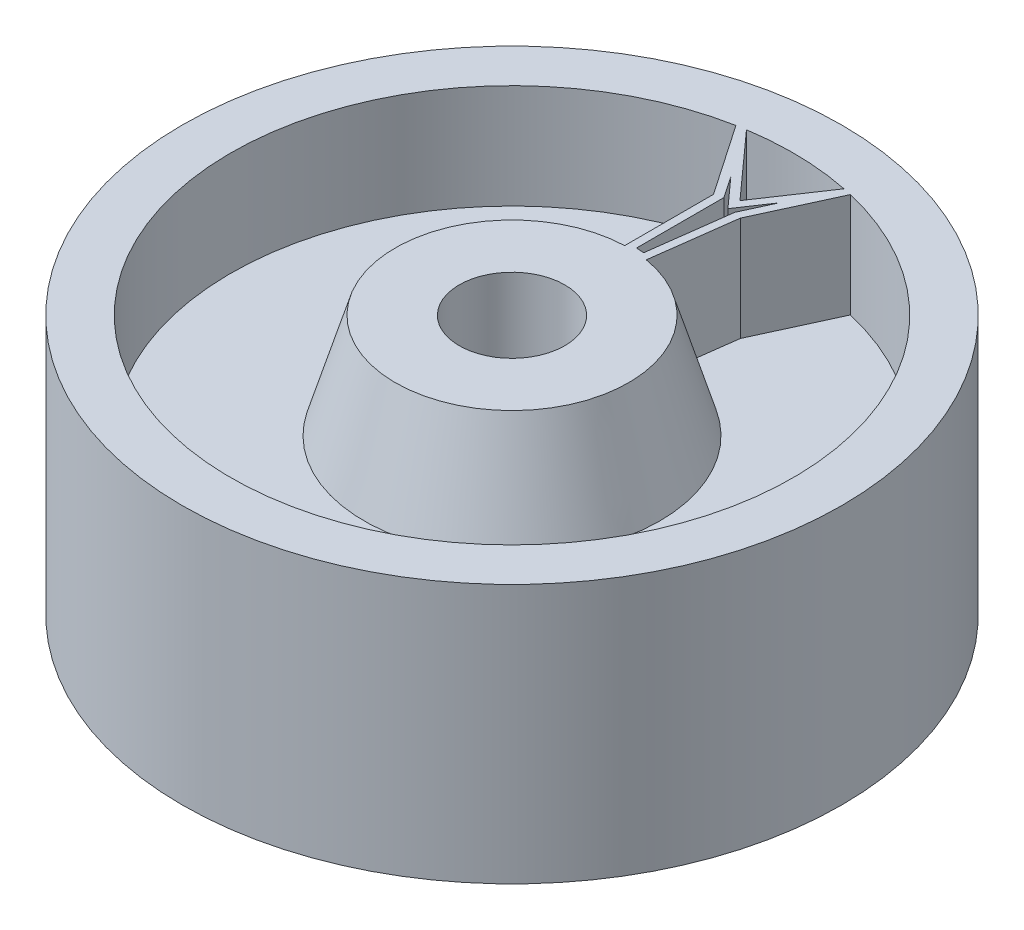
ISO-10303-21;
HEADER;
FILE_DESCRIPTION(('STEP AP214'),'2;1');
FILE_NAME('part.step','',(''),(''),'','','');
FILE_SCHEMA(('AUTOMOTIVE_DESIGN { 1 0 10303 214 1 1 1 1 }'));
ENDSEC;
DATA;
#1=APPLICATION_CONTEXT('core data for automotive mechanical design processes');
#2=APPLICATION_PROTOCOL_DEFINITION('international standard','automotive_design',2000,#1);
#3=PRODUCT_CONTEXT('',#1,'mechanical');
#4=PRODUCT('Part','Part','',(#3));
#5=PRODUCT_RELATED_PRODUCT_CATEGORY('part','',(#4));
#6=PRODUCT_DEFINITION_FORMATION('','',#4);
#7=PRODUCT_DEFINITION_CONTEXT('part definition',#1,'design');
#8=PRODUCT_DEFINITION('design','',#6,#7);
#9=PRODUCT_DEFINITION_SHAPE('','',#8);
#10=(LENGTH_UNIT() NAMED_UNIT(*) SI_UNIT(.MILLI.,.METRE.));
#11=(NAMED_UNIT(*) PLANE_ANGLE_UNIT() SI_UNIT($,.RADIAN.));
#12=(NAMED_UNIT(*) SI_UNIT($,.STERADIAN.) SOLID_ANGLE_UNIT());
#13=UNCERTAINTY_MEASURE_WITH_UNIT(LENGTH_MEASURE(1.E-05),#10,'distance_accuracy_value','');
#14=(GEOMETRIC_REPRESENTATION_CONTEXT(3) GLOBAL_UNCERTAINTY_ASSIGNED_CONTEXT((#13)) GLOBAL_UNIT_ASSIGNED_CONTEXT((#10,
#11,#12)) REPRESENTATION_CONTEXT('',''));
#15=CARTESIAN_POINT('',(0.,0.,0.));
#16=DIRECTION('',(0.,0.,1.));
#17=DIRECTION('',(1.,0.,0.));
#18=AXIS2_PLACEMENT_3D('',#15,#16,#17);
#19=CARTESIAN_POINT('',(0.,205.951906895944,0.));
#20=DIRECTION('',(0.,-1.,0.));
#21=DIRECTION('',(0.,0.,-1.));
#22=AXIS2_PLACEMENT_3D('',#19,#20,#21);
#23=CONICAL_SURFACE('',#22,185.425932002848,0.289503671961389);
#24=CARTESIAN_POINT('',(30.3648693949941,205.952106895944,-182.922740173142));
#25=CARTESIAN_POINT('',(30.8991054674038,192.151055759675,-187.001261731952));
#26=CARTESIAN_POINT('',(31.4333229107025,178.34996187389,-191.079641070431));
#27=CARTESIAN_POINT('',(32.5017260942476,150.74770135788,-199.236157716594));
#28=CARTESIAN_POINT('',(33.0359118344941,136.946534727655,-203.314295024277));
#29=CARTESIAN_POINT('',(34.1042571673054,109.344141472182,-211.470370020246));
#30=CARTESIAN_POINT('',(34.6384167598702,95.5429148469328,-215.548307708531));
#31=CARTESIAN_POINT('',(35.706713687662,67.9404105255742,-223.704013165776));
#32=CARTESIAN_POINT('',(36.240851022889,54.1391328294643,-227.781780934738));
#33=CARTESIAN_POINT('',(36.774979174481,40.337834063574,-231.85947859302));
#34=B_SPLINE_CURVE_WITH_KNOTS('',3,(#24,#25,#26,#27,#28,#29,#30,#31,#32,#33),.UNSPECIFIED.,.F.,
.F.,(4,2,2,2,4),(0.,43.2029955974903,86.4059911853262,129.608986770069,172.811982364436),.UNSPECIFIED.);
#35=CARTESIAN_POINT('',(30.3648771369603,205.951906895944,-182.92279927768));
#36=VERTEX_POINT('',#35);
#37=CARTESIAN_POINT('',(36.7749714342237,40.338034063574,-231.859419501529));
#38=VERTEX_POINT('',#37);
#39=EDGE_CURVE('E62',#36,#38,#34,.T.);
#40=ORIENTED_EDGE('',*,*,#39,.F.);
#41=CARTESIAN_POINT('',(0.,205.951906895944,0.));
#42=DIRECTION('',(0.,-1.,0.));
#43=DIRECTION('',(0.,0.,-1.));
#44=AXIS2_PLACEMENT_3D('',#41,#42,#43);
#45=CIRCLE('',#44,185.425932002848);
#46=CARTESIAN_POINT('',(-6.35,205.951906895944,-185.317170707749));
#47=VERTEX_POINT('',#46);
#48=EDGE_CURVE('E57',#36,#47,#45,.T.);
#49=ORIENTED_EDGE('',*,*,#48,.T.);
#50=CARTESIAN_POINT('',(-6.35,-134.258735067442,-286.694957783067));
#51=CARTESIAN_POINT('',(-6.35,-98.6265316781337,-276.078478487281));
#52=CARTESIAN_POINT('',(-6.35,-62.994392949212,-265.461782141148));
#53=CARTESIAN_POINT('',(-6.35,8.26965570479505,-244.227621210996));
#54=CARTESIAN_POINT('',(-6.35,43.9015656298797,-233.610156626974));
#55=CARTESIAN_POINT('',(-6.35,115.165056681502,-212.3741252363));
#56=CARTESIAN_POINT('',(-6.35,150.796637808043,-201.755558429658));
#57=CARTESIAN_POINT('',(-6.35,222.059282674897,-180.516688908846));
#58=CARTESIAN_POINT('',(-6.35,257.690346415211,-169.896386194679));
#59=CARTESIAN_POINT('',(-6.35,307.859096544723,-154.940625479311));
#60=CARTESIAN_POINT('',(-6.35,322.397157509582,-150.606424000766));
#61=CARTESIAN_POINT('',(-6.35,351.473079405832,-141.937350050352));
#62=CARTESIAN_POINT('',(-6.35,366.010940337221,-137.60247757848));
#63=CARTESIAN_POINT('',(-6.35,380.54867602696,-133.267185093496));
#64=B_SPLINE_CURVE_WITH_KNOTS('',3,(#50,#51,#52,#53,#54,#55,#56,#57,#58,#59,#60,#61,#62,#63),
.UNSPECIFIED.,.F.,.F.,(4,2,2,2,2,2,4),(0.,111.540449891671,223.080900085614,334.62134928247,
446.16179834175,491.672947199809,537.184096134438),.UNSPECIFIED.);
#65=CARTESIAN_POINT('',(-6.34999999999999,40.338034063574,-234.67182710239));
#66=VERTEX_POINT('',#65);
#67=EDGE_CURVE('E278',#66,#47,#64,.T.);
#68=ORIENTED_EDGE('',*,*,#67,.F.);
#69=CARTESIAN_POINT('',(0.,40.338034063574,0.));
#70=DIRECTION('',(0.,-1.,0.));
#71=DIRECTION('',(0.,0.,-1.));
#72=AXIS2_PLACEMENT_3D('',#69,#70,#71);
#73=CIRCLE('',#72,234.757723910363);
#74=EDGE_CURVE('E305',#38,#66,#73,.T.);
#75=ORIENTED_EDGE('',*,*,#74,.F.);
#76=EDGE_LOOP('',(#40,#49,#68,#75));
#77=FACE_BOUND('',#76,.T.);
#78=ADVANCED_FACE('F37',(#77),#23,.T.);
#79=CARTESIAN_POINT('',(-234.757723910363,40.338034063574,0.));
#80=DIRECTION('',(0.,-1.,0.));
#81=DIRECTION('',(0.,0.,-1.));
#82=AXIS2_PLACEMENT_3D('',#79,#80,#81);
#83=PLANE('',#82);
#84=DIRECTION('',(0.129878207357136,0.,-0.991529954793952));
#85=VECTOR('',#84,1.);
#86=CARTESIAN_POINT('',(2.33624005513325,40.338034063574,31.0563880255489));
#87=LINE('',#86,#85);
#88=CARTESIAN_POINT('',(47.6624694217819,40.338034063574,-314.977908793103));
#89=VERTEX_POINT('',#88);
#90=EDGE_CURVE('E346',#38,#89,#87,.T.);
#91=ORIENTED_EDGE('',*,*,#90,.F.);
#92=ORIENTED_EDGE('',*,*,#74,.T.);
#93=DIRECTION('',(0.,0.,1.));
#94=VECTOR('',#93,1.);
#95=CARTESIAN_POINT('',(-6.34999999999999,40.338034063574,0.));
#96=LINE('',#95,#94);
#97=CARTESIAN_POINT('',(-6.35,40.3380340635741,-326.474703970382));
#98=VERTEX_POINT('',#97);
#99=EDGE_CURVE('E343',#98,#66,#96,.T.);
#100=ORIENTED_EDGE('',*,*,#99,.F.);
#101=DIRECTION('',(0.564567927961281,0.,0.825386609242909));
#102=VECTOR('',#101,1.);
#103=CARTESIAN_POINT('',(72.9809249152727,40.338034063574,-210.494535985333));
#104=LINE('',#103,#102);
#105=CARTESIAN_POINT('',(-83.2749369819289,40.338034063574,-438.937367464248));
#106=VERTEX_POINT('',#105);
#107=EDGE_CURVE('E180',#106,#98,#104,.T.);
#108=ORIENTED_EDGE('',*,*,#107,.F.);
#109=CARTESIAN_POINT('',(0.,40.338034063574,0.));
#110=DIRECTION('',(0.,-1.,0.));
#111=DIRECTION('',(0.,0.,-1.));
#112=AXIS2_PLACEMENT_3D('',#109,#110,#111);
#113=CIRCLE('',#112,446.766972465276);
#114=CARTESIAN_POINT('',(102.681772682512,40.338034063574,-434.807062091413));
#115=VERTEX_POINT('',#114);
#116=EDGE_CURVE('E301',#115,#106,#113,.T.);
#117=ORIENTED_EDGE('',*,*,#116,.F.);
#118=DIRECTION('',(0.417266365347938,0.,-0.908784232009623));
#119=VECTOR('',#118,1.);
#120=CARTESIAN_POINT('',(-120.951282208579,40.338034063574,52.2539879208453));
#121=LINE('',#120,#119);
#122=EDGE_CURVE('E284',#89,#115,#121,.T.);
#123=ORIENTED_EDGE('',*,*,#122,.F.);
#124=EDGE_LOOP('',(#91,#92,#100,#108,#117,#123));
#125=FACE_BOUND('',#124,.T.);
#126=ADVANCED_FACE('F388',(#125),#83,.F.);
#127=DIRECTION('',(-0.556917904062446,0.,0.830567545799071));
#128=VECTOR('',#127,1.);
#129=CARTESIAN_POINT('',(-213.406083510078,40.338034063574,14.3168498217463));
#130=LINE('',#129,#128);
#131=CARTESIAN_POINT('',(89.667443425751,40.338034063574,-437.676224251762));
#132=VERTEX_POINT('',#131);
#133=CARTESIAN_POINT('',(23.3338890946393,40.338034063574,-338.748721610829));
#134=VERTEX_POINT('',#133);
#135=EDGE_CURVE('E287',#132,#134,#130,.T.);
#136=ORIENTED_EDGE('',*,*,#135,.F.);
#137=CARTESIAN_POINT('',(-68.9948603055098,40.338034063574,-441.407336750549));
#138=VERTEX_POINT('',#137);
#139=EDGE_CURVE('E298',#138,#132,#113,.T.);
#140=ORIENTED_EDGE('',*,*,#139,.F.);
#141=DIRECTION('',(-0.668708579859901,0.,-0.743524602970039));
#142=VECTOR('',#141,1.);
#143=CARTESIAN_POINT('',(76.3490603259006,40.338034063574,-279.802141099822));
#144=LINE('',#143,#142);
#145=EDGE_CURVE('E290',#134,#138,#144,.T.);
#146=ORIENTED_EDGE('',*,*,#145,.F.);
#147=EDGE_LOOP('',(#136,#140,#146));
#148=FACE_BOUND('',#147,.T.);
#149=ADVANCED_FACE('F392',(#148),#83,.F.);
#150=CARTESIAN_POINT('',(0.,0.,0.));
#151=DIRECTION('',(0.,-1.,0.));
#152=DIRECTION('',(0.,0.,-1.));
#153=AXIS2_PLACEMENT_3D('',#150,#151,#152);
#154=CYLINDRICAL_SURFACE('',#153,446.766972465276);
#155=DIRECTION('',(0.,-1.,0.));
#156=VECTOR('',#155,1.);
#157=CARTESIAN_POINT('',(102.681772682512,0.,-434.807062091413));
#158=LINE('',#157,#156);
#159=CARTESIAN_POINT('',(102.681772682512,205.951906895944,-434.807062091413));
#160=VERTEX_POINT('',#159);
#161=EDGE_CURVE('E340',#115,#160,#158,.F.);
#162=ORIENTED_EDGE('',*,*,#161,.F.);
#163=ORIENTED_EDGE('',*,*,#116,.T.);
#164=DIRECTION('',(0.,-1.,0.));
#165=VECTOR('',#164,1.);
#166=CARTESIAN_POINT('',(-83.2749369819289,0.,-438.937367464248));
#167=LINE('',#166,#165);
#168=CARTESIAN_POINT('',(-83.2749369819289,205.951906895944,-438.937367464248));
#169=VERTEX_POINT('',#168);
#170=EDGE_CURVE('E331',#169,#106,#167,.T.);
#171=ORIENTED_EDGE('',*,*,#170,.F.);
#172=CARTESIAN_POINT('',(0.,205.951906895944,0.));
#173=DIRECTION('',(0.,-1.,0.));
#174=DIRECTION('',(0.,0.,-1.));
#175=AXIS2_PLACEMENT_3D('',#172,#173,#174);
#176=CIRCLE('',#175,446.766972465276);
#177=EDGE_CURVE('E297',#160,#169,#176,.T.);
#178=ORIENTED_EDGE('',*,*,#177,.F.);
#179=EDGE_LOOP('',(#162,#163,#171,#178));
#180=FACE_BOUND('',#179,.T.);
#181=ADVANCED_FACE('F407',(#180),#154,.F.);
#182=DIRECTION('',(0.,-1.,0.));
#183=VECTOR('',#182,1.);
#184=CARTESIAN_POINT('',(89.667443425751,0.,-437.676224251762));
#185=LINE('',#184,#183);
#186=CARTESIAN_POINT('',(89.667443425751,205.951906895944,-437.676224251762));
#187=VERTEX_POINT('',#186);
#188=EDGE_CURVE('E337',#187,#132,#185,.T.);
#189=ORIENTED_EDGE('',*,*,#188,.F.);
#190=CARTESIAN_POINT('',(-68.9948603055098,205.951906895944,-441.407336750549));
#191=VERTEX_POINT('',#190);
#192=EDGE_CURVE('E242',#191,#187,#176,.T.);
#193=ORIENTED_EDGE('',*,*,#192,.F.);
#194=DIRECTION('',(0.,-1.,0.));
#195=VECTOR('',#194,1.);
#196=CARTESIAN_POINT('',(-68.9948603055098,0.,-441.407336750548));
#197=LINE('',#196,#195);
#198=EDGE_CURVE('E334',#138,#191,#197,.F.);
#199=ORIENTED_EDGE('',*,*,#198,.F.);
#200=ORIENTED_EDGE('',*,*,#139,.T.);
#201=EDGE_LOOP('',(#189,#193,#199,#200));
#202=FACE_BOUND('',#201,.T.);
#203=ADVANCED_FACE('F412',(#202),#154,.F.);
#204=CARTESIAN_POINT('',(0.,0.,0.));
#205=DIRECTION('',(0.,-1.,0.));
#206=DIRECTION('',(0.,0.,-1.));
#207=AXIS2_PLACEMENT_3D('',#204,#205,#206);
#208=CYLINDRICAL_SURFACE('',#207,523.701076511519);
#209=CARTESIAN_POINT('',(0.,-205.951906895944,0.));
#210=DIRECTION('',(0.,-1.,0.));
#211=DIRECTION('',(0.,0.,-1.));
#212=AXIS2_PLACEMENT_3D('',#209,#210,#211);
#213=CIRCLE('',#212,523.701076511519);
#214=CARTESIAN_POINT('',(0.,-205.951906895944,-523.701076511519));
#215=VERTEX_POINT('',#214);
#216=EDGE_CURVE('E325',#215,#215,#213,.T.);
#217=ORIENTED_EDGE('',*,*,#216,.F.);
#218=EDGE_LOOP('',(#217));
#219=FACE_BOUND('',#218,.T.);
#220=CARTESIAN_POINT('',(0.,205.951906895944,0.));
#221=DIRECTION('',(0.,-1.,0.));
#222=DIRECTION('',(0.,0.,-1.));
#223=AXIS2_PLACEMENT_3D('',#220,#221,#222);
#224=CIRCLE('',#223,523.701076511519);
#225=CARTESIAN_POINT('',(0.,205.951906895944,-523.701076511519));
#226=VERTEX_POINT('',#225);
#227=EDGE_CURVE('E328',#226,#226,#224,.T.);
#228=ORIENTED_EDGE('',*,*,#227,.T.);
#229=EDGE_LOOP('',(#228));
#230=FACE_BOUND('',#229,.T.);
#231=ADVANCED_FACE('F553',(#219,#230),#208,.T.);
#232=CARTESIAN_POINT('',(-446.766972465276,-205.951906895944,0.));
#233=DIRECTION('',(0.,-1.,0.));
#234=DIRECTION('',(0.,0.,-1.));
#235=AXIS2_PLACEMENT_3D('',#232,#233,#234);
#236=PLANE('',#235);
#237=ORIENTED_EDGE('',*,*,#216,.T.);
#238=EDGE_LOOP('',(#237));
#239=FACE_BOUND('',#238,.T.);
#240=CARTESIAN_POINT('',(0.,-205.951906895944,0.));
#241=DIRECTION('',(0.,-1.,0.));
#242=DIRECTION('',(0.,0.,-1.));
#243=AXIS2_PLACEMENT_3D('',#240,#241,#242);
#244=CIRCLE('',#243,446.766972465276);
#245=CARTESIAN_POINT('',(0.,-205.951906895944,-446.766972465276));
#246=VERTEX_POINT('',#245);
#247=EDGE_CURVE('E322',#246,#246,#244,.T.);
#248=ORIENTED_EDGE('',*,*,#247,.F.);
#249=EDGE_LOOP('',(#248));
#250=FACE_BOUND('',#249,.T.);
#251=ADVANCED_FACE('F544',(#239,#250),#236,.T.);
#252=CARTESIAN_POINT('',(0.,0.,0.));
#253=DIRECTION('',(0.,-1.,0.));
#254=DIRECTION('',(0.,0.,-1.));
#255=AXIS2_PLACEMENT_3D('',#252,#253,#254);
#256=CYLINDRICAL_SURFACE('',#255,446.766972465276);
#257=ORIENTED_EDGE('',*,*,#247,.T.);
#258=EDGE_LOOP('',(#257));
#259=FACE_BOUND('',#258,.T.);
#260=CARTESIAN_POINT('',(0.,-40.338034063574,0.));
#261=DIRECTION('',(0.,-1.,0.));
#262=DIRECTION('',(0.,0.,-1.));
#263=AXIS2_PLACEMENT_3D('',#260,#261,#262);
#264=CIRCLE('',#263,446.766972465276);
#265=CARTESIAN_POINT('',(0.,-40.338034063574,-446.766972465276));
#266=VERTEX_POINT('',#265);
#267=EDGE_CURVE('E319',#266,#266,#264,.T.);
#268=ORIENTED_EDGE('',*,*,#267,.F.);
#269=EDGE_LOOP('',(#268));
#270=FACE_BOUND('',#269,.T.);
#271=ADVANCED_FACE('F535',(#259,#270),#256,.F.);
#272=CARTESIAN_POINT('',(-234.757723910363,-40.338034063574,0.));
#273=DIRECTION('',(0.,-1.,0.));
#274=DIRECTION('',(0.,0.,-1.));
#275=AXIS2_PLACEMENT_3D('',#272,#273,#274);
#276=PLANE('',#275);
#277=CARTESIAN_POINT('',(0.,-40.338034063574,0.));
#278=DIRECTION('',(0.,-1.,0.));
#279=DIRECTION('',(0.,0.,-1.));
#280=AXIS2_PLACEMENT_3D('',#277,#278,#279);
#281=CIRCLE('',#280,234.757723910363);
#282=CARTESIAN_POINT('',(0.,-40.338034063574,-234.757723910363));
#283=VERTEX_POINT('',#282);
#284=EDGE_CURVE('E316',#283,#283,#281,.T.);
#285=ORIENTED_EDGE('',*,*,#284,.F.);
#286=EDGE_LOOP('',(#285));
#287=FACE_BOUND('',#286,.T.);
#288=ORIENTED_EDGE('',*,*,#267,.T.);
#289=EDGE_LOOP('',(#288));
#290=FACE_BOUND('',#289,.T.);
#291=ADVANCED_FACE('F526',(#287,#290),#276,.T.);
#292=CARTESIAN_POINT('',(0.,-205.951906895944,0.));
#293=DIRECTION('',(0.,1.,0.));
#294=DIRECTION('',(0.,0.,1.));
#295=AXIS2_PLACEMENT_3D('',#292,#293,#294);
#296=CONICAL_SURFACE('',#295,185.425932002848,0.289503671961389);
#297=ORIENTED_EDGE('',*,*,#284,.T.);
#298=EDGE_LOOP('',(#297));
#299=FACE_BOUND('',#298,.T.);
#300=CARTESIAN_POINT('',(0.,-205.951906895944,0.));
#301=DIRECTION('',(0.,-1.,0.));
#302=DIRECTION('',(0.,0.,-1.));
#303=AXIS2_PLACEMENT_3D('',#300,#301,#302);
#304=CIRCLE('',#303,185.425932002848);
#305=CARTESIAN_POINT('',(0.,-205.951906895944,-185.425932002848));
#306=VERTEX_POINT('',#305);
#307=EDGE_CURVE('E313',#306,#306,#304,.T.);
#308=ORIENTED_EDGE('',*,*,#307,.F.);
#309=EDGE_LOOP('',(#308));
#310=FACE_BOUND('',#309,.T.);
#311=ADVANCED_FACE('F516',(#299,#310),#296,.T.);
#312=CARTESIAN_POINT('',(-83.8259320028483,-205.951906895944,0.));
#313=DIRECTION('',(0.,-1.,0.));
#314=DIRECTION('',(0.,0.,-1.));
#315=AXIS2_PLACEMENT_3D('',#312,#313,#314);
#316=PLANE('',#315);
#317=ORIENTED_EDGE('',*,*,#307,.T.);
#318=EDGE_LOOP('',(#317));
#319=FACE_BOUND('',#318,.T.);
#320=CARTESIAN_POINT('',(0.,-205.951906895944,0.));
#321=DIRECTION('',(0.,-1.,0.));
#322=DIRECTION('',(0.,0.,-1.));
#323=AXIS2_PLACEMENT_3D('',#320,#321,#322);
#324=CIRCLE('',#323,83.8259320028483);
#325=CARTESIAN_POINT('',(0.,-205.951906895944,-83.8259320028483));
#326=VERTEX_POINT('',#325);
#327=EDGE_CURVE('E310',#326,#326,#324,.T.);
#328=ORIENTED_EDGE('',*,*,#327,.F.);
#329=EDGE_LOOP('',(#328));
#330=FACE_BOUND('',#329,.T.);
#331=ADVANCED_FACE('F507',(#319,#330),#316,.T.);
#332=CARTESIAN_POINT('',(0.,0.,0.));
#333=DIRECTION('',(0.,-1.,0.));
#334=DIRECTION('',(0.,0.,-1.));
#335=AXIS2_PLACEMENT_3D('',#332,#333,#334);
#336=CYLINDRICAL_SURFACE('',#335,83.8259320028483);
#337=CARTESIAN_POINT('',(0.,205.951906895944,0.));
#338=DIRECTION('',(0.,-1.,0.));
#339=DIRECTION('',(0.,0.,-1.));
#340=AXIS2_PLACEMENT_3D('',#337,#338,#339);
#341=CIRCLE('',#340,83.8259320028483);
#342=CARTESIAN_POINT('',(0.,205.951906895944,-83.8259320028483));
#343=VERTEX_POINT('',#342);
#344=EDGE_CURVE('E307',#343,#343,#341,.T.);
#345=ORIENTED_EDGE('',*,*,#344,.F.);
#346=EDGE_LOOP('',(#345));
#347=FACE_BOUND('',#346,.T.);
#348=ORIENTED_EDGE('',*,*,#327,.T.);
#349=EDGE_LOOP('',(#348));
#350=FACE_BOUND('',#349,.T.);
#351=ADVANCED_FACE('F496',(#347,#350),#336,.F.);
#352=CARTESIAN_POINT('',(-83.8259320028483,205.951906895944,0.));
#353=DIRECTION('',(0.,-1.,0.));
#354=DIRECTION('',(0.,0.,-1.));
#355=AXIS2_PLACEMENT_3D('',#352,#353,#354);
#356=PLANE('',#355);
#357=ORIENTED_EDGE('',*,*,#48,.F.);
#358=DIRECTION('',(-0.129878207357136,0.,0.991529954793952));
#359=VECTOR('',#358,1.);
#360=CARTESIAN_POINT('',(47.7871944092973,205.951906895944,-315.930097491649));
#361=LINE('',#360,#359);
#362=CARTESIAN_POINT('',(47.6624694217819,205.951906895944,-314.977908793103));
#363=VERTEX_POINT('',#362);
#364=EDGE_CURVE('E203',#36,#363,#361,.F.);
#365=ORIENTED_EDGE('',*,*,#364,.T.);
#366=DIRECTION('',(-0.417266365347938,0.,0.908784232009623));
#367=VECTOR('',#366,1.);
#368=CARTESIAN_POINT('',(102.128675652032,205.951906895944,-433.602445803559));
#369=LINE('',#368,#367);
#370=EDGE_CURVE('E213',#363,#160,#369,.F.);
#371=ORIENTED_EDGE('',*,*,#370,.T.);
#372=ORIENTED_EDGE('',*,*,#177,.T.);
#373=DIRECTION('',(-0.564567927961281,0.,-0.825386609242909));
#374=VECTOR('',#373,1.);
#375=CARTESIAN_POINT('',(-5.24120496869247,205.951906895944,-324.853668615893));
#376=LINE('',#375,#374);
#377=CARTESIAN_POINT('',(-6.35,205.951906895944,-326.474703970382));
#378=VERTEX_POINT('',#377);
#379=EDGE_CURVE('E219',#169,#378,#376,.F.);
#380=ORIENTED_EDGE('',*,*,#379,.T.);
#381=DIRECTION('',(0.,0.,-1.));
#382=VECTOR('',#381,1.);
#383=CARTESIAN_POINT('',(-6.35,205.951906895944,-185.425932002848));
#384=LINE('',#383,#382);
#385=EDGE_CURVE('E223',#378,#47,#384,.F.);
#386=ORIENTED_EDGE('',*,*,#385,.T.);
#387=EDGE_LOOP('',(#357,#365,#371,#372,#380,#386));
#388=FACE_BOUND('',#387,.T.);
#389=ORIENTED_EDGE('',*,*,#344,.T.);
#390=EDGE_LOOP('',(#389));
#391=FACE_BOUND('',#390,.T.);
#392=ORIENTED_EDGE('',*,*,#192,.T.);
#393=DIRECTION('',(0.556917904062446,0.,-0.830567545799071));
#394=VECTOR('',#393,1.);
#395=CARTESIAN_POINT('',(18.7919958589043,205.951906895944,-331.975103649243));
#396=LINE('',#395,#394);
#397=CARTESIAN_POINT('',(23.3338890946394,205.951906895944,-338.748721610829));
#398=VERTEX_POINT('',#397);
#399=EDGE_CURVE('E214',#187,#398,#396,.F.);
#400=ORIENTED_EDGE('',*,*,#399,.T.);
#401=DIRECTION('',(0.668708579859901,0.,0.743524602970039));
#402=VECTOR('',#401,1.);
#403=CARTESIAN_POINT('',(-71.7105150115498,205.951906895944,-444.42682258926));
#404=LINE('',#403,#402);
#405=EDGE_CURVE('E218',#398,#191,#404,.F.);
#406=ORIENTED_EDGE('',*,*,#405,.T.);
#407=EDGE_LOOP('',(#392,#400,#406));
#408=FACE_BOUND('',#407,.T.);
#409=ORIENTED_EDGE('',*,*,#227,.F.);
#410=EDGE_LOOP('',(#409));
#411=FACE_BOUND('',#410,.T.);
#412=DIRECTION('',(-0.129878207357136,0.,0.991529954793952));
#413=VECTOR('',#412,1.);
#414=CARTESIAN_POINT('',(35.1947639834142,205.951906895944,-317.579550725084));
#415=LINE('',#414,#413);
#416=CARTESIAN_POINT('',(18.5592661972852,205.951906895944,-190.579073096848));
#417=VERTEX_POINT('',#416);
#418=CARTESIAN_POINT('',(35.3194889709296,205.951906895944,-318.53173942363));
#419=VERTEX_POINT('',#418);
#420=EDGE_CURVE('E176',#417,#419,#415,.F.);
#421=ORIENTED_EDGE('',*,*,#420,.F.);
#422=DIRECTION('',(-0.997880242011523,0.,-0.0650770512778798));
#423=VECTOR('',#422,1.);
#424=CARTESIAN_POINT('',(24.4960269216706,205.951906895944,-190.191905513184));
#425=LINE('',#424,#423);
#426=CARTESIAN_POINT('',(6.35,205.951906895944,-191.375303955958));
#427=VERTEX_POINT('',#426);
#428=EDGE_CURVE('E173',#427,#417,#425,.F.);
#429=ORIENTED_EDGE('',*,*,#428,.F.);
#430=DIRECTION('',(0.,0.,-1.));
#431=VECTOR('',#430,1.);
#432=CARTESIAN_POINT('',(6.35,205.951906895944,-185.425932002848));
#433=LINE('',#432,#431);
#434=CARTESIAN_POINT('',(6.35,205.951906895944,-330.402645946511));
#435=VERTEX_POINT('',#434);
#436=EDGE_CURVE('E161',#435,#427,#433,.F.);
#437=ORIENTED_EDGE('',*,*,#436,.F.);
#438=DIRECTION('',(-0.564567927961281,0.,-0.825386609242909));
#439=VECTOR('',#438,1.);
#440=CARTESIAN_POINT('',(5.24120496869247,205.951906895944,-332.023681301001));
#441=LINE('',#440,#439);
#442=CARTESIAN_POINT('',(-17.1814591021013,205.951906895944,-364.805151432359));
#443=VERTEX_POINT('',#442);
#444=EDGE_CURVE('E186',#443,#435,#441,.F.);
#445=ORIENTED_EDGE('',*,*,#444,.F.);
#446=DIRECTION('',(0.668708579859901,0.,0.743524602970039));
#447=VECTOR('',#446,1.);
#448=CARTESIAN_POINT('',(-81.1532774692693,205.951906895944,-435.93422362504));
#449=LINE('',#448,#447);
#450=CARTESIAN_POINT('',(24.7983104548174,205.951906895944,-318.128628306065));
#451=VERTEX_POINT('',#450);
#452=EDGE_CURVE('E199',#451,#443,#449,.F.);
#453=ORIENTED_EDGE('',*,*,#452,.F.);
#454=DIRECTION('',(0.556917904062446,0.,-0.830567545799071));
#455=VECTOR('',#454,1.);
#456=CARTESIAN_POINT('',(29.3402036905525,205.951906895944,-324.90224626765));
#457=LINE('',#456,#455);
#458=CARTESIAN_POINT('',(57.5859864028586,205.951906895944,-367.027001559955));
#459=VERTEX_POINT('',#458);
#460=EDGE_CURVE('E195',#459,#451,#457,.F.);
#461=ORIENTED_EDGE('',*,*,#460,.F.);
#462=DIRECTION('',(-0.417266365347938,0.,0.908784232009623));
#463=VECTOR('',#462,1.);
#464=CARTESIAN_POINT('',(90.5871159055094,205.951906895944,-438.901728643478));
#465=LINE('',#464,#463);
#466=EDGE_CURVE('E191',#419,#459,#465,.F.);
#467=ORIENTED_EDGE('',*,*,#466,.F.);
#468=EDGE_LOOP('',(#421,#429,#437,#445,#453,#461,#467));
#469=FACE_BOUND('',#468,.T.);
#470=ADVANCED_FACE('F174',(#388,#391,#408,#411,#469),#356,.F.);
#471=CARTESIAN_POINT('',(24.4960269216706,205.951906895944,-190.191905513184));
#472=DIRECTION('',(0.0650770512778798,0.,-0.997880242011523));
#473=DIRECTION('',(-0.997880242011523,0.,-0.0650770512778798));
#474=AXIS2_PLACEMENT_3D('',#471,#472,#473);
#475=PLANE('',#474);
#476=CARTESIAN_POINT('',(6.3498,185.625418559535,-191.375316999016));
#477=CARTESIAN_POINT('',(8.38474436621419,185.844207485226,-191.242607508145));
#478=CARTESIAN_POINT('',(10.4196887324284,185.953601948072,-191.109898017274));
#479=CARTESIAN_POINT('',(14.4895774648568,185.953601948072,-190.844479035531));
#480=CARTESIAN_POINT('',(16.524521831071,185.844207485226,-190.71176954466));
#481=CARTESIAN_POINT('',(18.5594661972852,185.625418559535,-190.579060053789));
#482=B_SPLINE_CURVE_WITH_KNOTS('',3,(#476,#477,#478,#479,#480,#481),.UNSPECIFIED.,.F.,.F.,(4,2,
4),(0.,6.12659756957307,12.2531951391461),.UNSPECIFIED.);
#483=CARTESIAN_POINT('',(6.35,185.62544005688,-191.375303955958));
#484=VERTEX_POINT('',#483);
#485=CARTESIAN_POINT('',(18.5592661972852,185.62544005688,-190.579073096848));
#486=VERTEX_POINT('',#485);
#487=EDGE_CURVE('E11',#484,#486,#482,.T.);
#488=ORIENTED_EDGE('',*,*,#487,.F.);
#489=DIRECTION('',(0.,-1.,0.));
#490=VECTOR('',#489,1.);
#491=CARTESIAN_POINT('',(6.35,205.951906895944,-191.375303955958));
#492=LINE('',#491,#490);
#493=EDGE_CURVE('E165',#427,#484,#492,.T.);
#494=ORIENTED_EDGE('',*,*,#493,.F.);
#495=ORIENTED_EDGE('',*,*,#428,.T.);
#496=DIRECTION('',(0.,-1.,0.));
#497=VECTOR('',#496,1.);
#498=CARTESIAN_POINT('',(18.5592661972852,205.951906895944,-190.579073096848));
#499=LINE('',#498,#497);
#500=EDGE_CURVE('E189',#417,#486,#499,.T.);
#501=ORIENTED_EDGE('',*,*,#500,.T.);
#502=EDGE_LOOP('',(#488,#494,#495,#501));
#503=FACE_BOUND('',#502,.T.);
#504=ADVANCED_FACE('F182',(#503),#475,.T.);
#505=CARTESIAN_POINT('',(35.1947639834142,205.951906895944,-317.579550725084));
#506=DIRECTION('',(-0.991529954793952,0.,-0.129878207357136));
#507=DIRECTION('',(-0.129878207357136,0.,0.991529954793952));
#508=AXIS2_PLACEMENT_3D('',#505,#506,#507);
#509=PLANE('',#508);
#510=CARTESIAN_POINT('',(18.5592399997494,185.626116848601,-190.578873096848));
#511=CARTESIAN_POINT('',(19.0278925980589,173.518859845211,-194.156710357399));
#512=CARTESIAN_POINT('',(19.4965320853661,161.411572756002,-197.734447524548));
#513=CARTESIAN_POINT('',(20.4337882927115,137.196946337681,-204.889748046553));
#514=CARTESIAN_POINT('',(20.9024050127498,125.08960700857,-208.467311401409));
#515=CARTESIAN_POINT('',(21.8396191404196,100.87488403892,-215.622290674301));
#516=CARTESIAN_POINT('',(22.3082165480511,88.7675003983814,-219.199706592337));
#517=CARTESIAN_POINT('',(23.2453945917893,64.5526946346747,-226.35441038946));
#518=CARTESIAN_POINT('',(23.713975227896,52.4452725115063,-229.931698268546));
#519=CARTESIAN_POINT('',(24.1825487485978,40.337834063574,-233.508931826456));
#520=B_SPLINE_CURVE_WITH_KNOTS('',3,(#510,#511,#512,#513,#514,#515,#516,#517,#518,#519),
.UNSPECIFIED.,.F.,.F.,(4,2,2,2,4),(0.,37.9006074057007,75.8012148054735,113.7018222036,
151.602429607643),.UNSPECIFIED.);
#521=CARTESIAN_POINT('',(24.1825410083405,40.338034063574,-233.508872734965));
#522=VERTEX_POINT('',#521);
#523=EDGE_CURVE('E233',#486,#522,#520,.T.);
#524=ORIENTED_EDGE('',*,*,#523,.F.);
#525=ORIENTED_EDGE('',*,*,#500,.F.);
#526=ORIENTED_EDGE('',*,*,#420,.T.);
#527=DIRECTION('',(0.,-1.,0.));
#528=VECTOR('',#527,1.);
#529=CARTESIAN_POINT('',(35.3194889709296,205.951906895944,-318.53173942363));
#530=LINE('',#529,#528);
#531=CARTESIAN_POINT('',(35.3194889709296,40.338034063574,-318.53173942363));
#532=VERTEX_POINT('',#531);
#533=EDGE_CURVE('E192',#419,#532,#530,.T.);
#534=ORIENTED_EDGE('',*,*,#533,.T.);
#535=DIRECTION('',(0.129878207357136,0.,-0.991529954793952));
#536=VECTOR('',#535,1.);
#537=CARTESIAN_POINT('',(-10.2561903707499,40.338034063574,29.4069347921133));
#538=LINE('',#537,#536);
#539=EDGE_CURVE('E50',#522,#532,#538,.T.);
#540=ORIENTED_EDGE('',*,*,#539,.F.);
#541=EDGE_LOOP('',(#524,#525,#526,#534,#540));
#542=FACE_BOUND('',#541,.T.);
#543=ADVANCED_FACE('F253',(#542),#509,.T.);
#544=CARTESIAN_POINT('',(90.5871159055094,205.951906895944,-438.901728643478));
#545=DIRECTION('',(-0.908784232009623,0.,-0.417266365347938));
#546=DIRECTION('',(-0.417266365347938,0.,0.908784232009623));
#547=AXIS2_PLACEMENT_3D('',#544,#545,#546);
#548=PLANE('',#547);
#549=DIRECTION('',(0.417266365347938,0.,-0.908784232009623));
#550=VECTOR('',#549,1.);
#551=CARTESIAN_POINT('',(-132.492841955101,40.338034063574,46.9547050809265));
#552=LINE('',#551,#550);
#553=CARTESIAN_POINT('',(57.5859864028585,40.338034063574,-367.027001559955));
#554=VERTEX_POINT('',#553);
#555=EDGE_CURVE('E361',#532,#554,#552,.T.);
#556=ORIENTED_EDGE('',*,*,#555,.F.);
#557=ORIENTED_EDGE('',*,*,#533,.F.);
#558=ORIENTED_EDGE('',*,*,#466,.T.);
#559=DIRECTION('',(0.,-1.,0.));
#560=VECTOR('',#559,1.);
#561=CARTESIAN_POINT('',(57.5859864028585,205.951906895944,-367.027001559955));
#562=LINE('',#561,#560);
#563=EDGE_CURVE('E196',#459,#554,#562,.T.);
#564=ORIENTED_EDGE('',*,*,#563,.T.);
#565=EDGE_LOOP('',(#556,#557,#558,#564));
#566=FACE_BOUND('',#565,.T.);
#567=ADVANCED_FACE('F258',(#566),#548,.T.);
#568=CARTESIAN_POINT('',(29.3402036905525,205.951906895944,-324.90224626765));
#569=DIRECTION('',(0.830567545799071,0.,0.556917904062446));
#570=DIRECTION('',(0.556917904062446,0.,-0.830567545799071));
#571=AXIS2_PLACEMENT_3D('',#568,#569,#570);
#572=PLANE('',#571);
#573=DIRECTION('',(-0.556917904062446,0.,0.830567545799071));
#574=VECTOR('',#573,1.);
#575=CARTESIAN_POINT('',(-202.85787567843,40.338034063574,21.3897072033393));
#576=LINE('',#575,#574);
#577=CARTESIAN_POINT('',(24.7983104548174,40.338034063574,-318.128628306065));
#578=VERTEX_POINT('',#577);
#579=EDGE_CURVE('E358',#554,#578,#576,.T.);
#580=ORIENTED_EDGE('',*,*,#579,.F.);
#581=ORIENTED_EDGE('',*,*,#563,.F.);
#582=ORIENTED_EDGE('',*,*,#460,.T.);
#583=DIRECTION('',(0.,-1.,0.));
#584=VECTOR('',#583,1.);
#585=CARTESIAN_POINT('',(24.7983104548174,205.951906895944,-318.128628306065));
#586=LINE('',#585,#584);
#587=EDGE_CURVE('E200',#451,#578,#586,.T.);
#588=ORIENTED_EDGE('',*,*,#587,.T.);
#589=EDGE_LOOP('',(#580,#581,#582,#588));
#590=FACE_BOUND('',#589,.T.);
#591=ADVANCED_FACE('F379',(#590),#572,.T.);
#592=CARTESIAN_POINT('',(-81.1532774692693,205.951906895944,-435.93422362504));
#593=DIRECTION('',(-0.743524602970039,0.,0.668708579859901));
#594=DIRECTION('',(0.668708579859901,0.,0.743524602970039));
#595=AXIS2_PLACEMENT_3D('',#592,#593,#594);
#596=PLANE('',#595);
#597=DIRECTION('',(-0.668708579859901,0.,-0.743524602970039));
#598=VECTOR('',#597,1.);
#599=CARTESIAN_POINT('',(66.9062978681812,40.338034063574,-271.309542135602));
#600=LINE('',#599,#598);
#601=CARTESIAN_POINT('',(-17.1814591021013,40.338034063574,-364.805151432359));
#602=VERTEX_POINT('',#601);
#603=EDGE_CURVE('E355',#578,#602,#600,.T.);
#604=ORIENTED_EDGE('',*,*,#603,.F.);
#605=ORIENTED_EDGE('',*,*,#587,.F.);
#606=ORIENTED_EDGE('',*,*,#452,.T.);
#607=DIRECTION('',(0.,-1.,0.));
#608=VECTOR('',#607,1.);
#609=CARTESIAN_POINT('',(-17.1814591021013,205.951906895944,-364.805151432359));
#610=LINE('',#609,#608);
#611=EDGE_CURVE('E183',#443,#602,#610,.T.);
#612=ORIENTED_EDGE('',*,*,#611,.T.);
#613=EDGE_LOOP('',(#604,#605,#606,#612));
#614=FACE_BOUND('',#613,.T.);
#615=ADVANCED_FACE('F373',(#614),#596,.T.);
#616=CARTESIAN_POINT('',(5.24120496869247,205.951906895944,-332.023681301001));
#617=DIRECTION('',(0.825386609242909,0.,-0.564567927961281));
#618=DIRECTION('',(-0.564567927961281,0.,-0.825386609242909));
#619=AXIS2_PLACEMENT_3D('',#616,#617,#618);
#620=PLANE('',#619);
#621=DIRECTION('',(0.564567927961281,0.,0.825386609242909));
#622=VECTOR('',#621,1.);
#623=CARTESIAN_POINT('',(83.4633348526576,40.338034063574,-217.664548670441));
#624=LINE('',#623,#622);
#625=CARTESIAN_POINT('',(6.35,40.3380340635741,-330.402645946511));
#626=VERTEX_POINT('',#625);
#627=EDGE_CURVE('E352',#602,#626,#624,.T.);
#628=ORIENTED_EDGE('',*,*,#627,.F.);
#629=ORIENTED_EDGE('',*,*,#611,.F.);
#630=ORIENTED_EDGE('',*,*,#444,.T.);
#631=DIRECTION('',(0.,-1.,0.));
#632=VECTOR('',#631,1.);
#633=CARTESIAN_POINT('',(6.35,205.951906895944,-330.402645946511));
#634=LINE('',#633,#632);
#635=EDGE_CURVE('E168',#435,#626,#634,.T.);
#636=ORIENTED_EDGE('',*,*,#635,.T.);
#637=EDGE_LOOP('',(#628,#629,#630,#636));
#638=FACE_BOUND('',#637,.T.);
#639=ADVANCED_FACE('F267',(#638),#620,.T.);
#640=CARTESIAN_POINT('',(6.35,205.951906895944,-185.425932002848));
#641=DIRECTION('',(1.,0.,0.));
#642=DIRECTION('',(0.,0.,-1.));
#643=AXIS2_PLACEMENT_3D('',#640,#641,#642);
#644=PLANE('',#643);
#645=CARTESIAN_POINT('',(6.35,-130.863770004953,-285.683442694541));
#646=CARTESIAN_POINT('',(6.35,-95.3572272491124,-275.104384868787));
#647=CARTESIAN_POINT('',(6.35,-59.8507493672662,-264.525109275585));
#648=CARTESIAN_POINT('',(6.35,11.1619767818419,-243.365787127693));
#649=CARTESIAN_POINT('',(6.35,46.6682250491032,-232.785740573002));
#650=CARTESIAN_POINT('',(6.35,117.68039159456,-211.62454122688));
#651=CARTESIAN_POINT('',(6.35,153.186309872758,-201.043388435457));
#652=CARTESIAN_POINT('',(6.35,224.197627327996,-179.879341197694));
#653=CARTESIAN_POINT('',(6.35,259.703026505035,-169.296446751355));
#654=CARTESIAN_POINT('',(6.35,308.865758767355,-154.640505815058));
#655=CARTESIAN_POINT('',(6.35,322.523476306402,-150.568748974347));
#656=CARTESIAN_POINT('',(6.35,349.83873582307,-142.424646387443));
#657=CARTESIAN_POINT('',(6.35,363.496277800691,-138.35230064125));
#658=CARTESIAN_POINT('',(6.35,377.153710964471,-134.279589971668));
#659=B_SPLINE_CURVE_WITH_KNOTS('',3,(#645,#646,#647,#648,#649,#650,#651,#652,#653,#654,#655,
#656,#657,#658),.UNSPECIFIED.,.F.,.F.,(4,2,2,2,2,2,4),(0.,111.147106977776,222.294214261579,
333.441320567579,444.588426733832,487.34368451948,530.098942371526),.UNSPECIFIED.);
#660=CARTESIAN_POINT('',(6.34999999999999,40.338034063574,-234.67182710239));
#661=VERTEX_POINT('',#660);
#662=EDGE_CURVE('E243',#661,#484,#659,.T.);
#663=ORIENTED_EDGE('',*,*,#662,.F.);
#664=DIRECTION('',(0.,0.,1.));
#665=VECTOR('',#664,1.);
#666=CARTESIAN_POINT('',(6.34999999999999,40.338034063574,0.));
#667=LINE('',#666,#665);
#668=EDGE_CURVE('E349',#626,#661,#667,.T.);
#669=ORIENTED_EDGE('',*,*,#668,.F.);
#670=ORIENTED_EDGE('',*,*,#635,.F.);
#671=ORIENTED_EDGE('',*,*,#436,.T.);
#672=ORIENTED_EDGE('',*,*,#493,.T.);
#673=EDGE_LOOP('',(#663,#669,#670,#671,#672));
#674=FACE_BOUND('',#673,.T.);
#675=ADVANCED_FACE('F163',(#674),#644,.T.);
#676=CARTESIAN_POINT('',(47.7871944092973,205.951906895944,-315.930097491649));
#677=DIRECTION('',(-0.991529954793952,0.,-0.129878207357136));
#678=DIRECTION('',(-0.129878207357136,0.,0.991529954793952));
#679=AXIS2_PLACEMENT_3D('',#676,#677,#678);
#680=PLANE('',#679);
#681=ORIENTED_EDGE('',*,*,#364,.F.);
#682=ORIENTED_EDGE('',*,*,#39,.T.);
#683=ORIENTED_EDGE('',*,*,#90,.T.);
#684=DIRECTION('',(0.,-1.,0.));
#685=VECTOR('',#684,1.);
#686=CARTESIAN_POINT('',(47.6624694217819,205.951906895944,-314.977908793103));
#687=LINE('',#686,#685);
#688=EDGE_CURVE('E210',#363,#89,#687,.T.);
#689=ORIENTED_EDGE('',*,*,#688,.F.);
#690=EDGE_LOOP('',(#681,#682,#683,#689));
#691=FACE_BOUND('',#690,.T.);
#692=ADVANCED_FACE('F266',(#691),#680,.F.);
#693=CARTESIAN_POINT('',(-6.35,205.951906895944,-185.425932002848));
#694=DIRECTION('',(1.,0.,0.));
#695=DIRECTION('',(0.,0.,-1.));
#696=AXIS2_PLACEMENT_3D('',#693,#694,#695);
#697=PLANE('',#696);
#698=ORIENTED_EDGE('',*,*,#99,.T.);
#699=ORIENTED_EDGE('',*,*,#67,.T.);
#700=ORIENTED_EDGE('',*,*,#385,.F.);
#701=DIRECTION('',(0.,-1.,0.));
#702=VECTOR('',#701,1.);
#703=CARTESIAN_POINT('',(-6.35,205.951906895944,-326.474703970382));
#704=LINE('',#703,#702);
#705=EDGE_CURVE('E220',#378,#98,#704,.T.);
#706=ORIENTED_EDGE('',*,*,#705,.T.);
#707=EDGE_LOOP('',(#698,#699,#700,#706));
#708=FACE_BOUND('',#707,.T.);
#709=ADVANCED_FACE('F270',(#708),#697,.F.);
#710=CARTESIAN_POINT('',(102.128675652032,205.951906895944,-433.602445803559));
#711=DIRECTION('',(-0.908784232009623,0.,-0.417266365347938));
#712=DIRECTION('',(-0.417266365347938,0.,0.908784232009623));
#713=AXIS2_PLACEMENT_3D('',#710,#711,#712);
#714=PLANE('',#713);
#715=ORIENTED_EDGE('',*,*,#688,.T.);
#716=ORIENTED_EDGE('',*,*,#122,.T.);
#717=ORIENTED_EDGE('',*,*,#161,.T.);
#718=ORIENTED_EDGE('',*,*,#370,.F.);
#719=EDGE_LOOP('',(#715,#716,#717,#718));
#720=FACE_BOUND('',#719,.T.);
#721=ADVANCED_FACE('F428',(#720),#714,.F.);
#722=CARTESIAN_POINT('',(18.7919958589043,205.951906895944,-331.975103649243));
#723=DIRECTION('',(0.830567545799071,0.,0.556917904062446));
#724=DIRECTION('',(0.556917904062446,0.,-0.830567545799071));
#725=AXIS2_PLACEMENT_3D('',#722,#723,#724);
#726=PLANE('',#725);
#727=ORIENTED_EDGE('',*,*,#188,.T.);
#728=ORIENTED_EDGE('',*,*,#135,.T.);
#729=DIRECTION('',(0.,-1.,0.));
#730=VECTOR('',#729,1.);
#731=CARTESIAN_POINT('',(23.3338890946394,205.951906895944,-338.748721610829));
#732=LINE('',#731,#730);
#733=EDGE_CURVE('E215',#398,#134,#732,.T.);
#734=ORIENTED_EDGE('',*,*,#733,.F.);
#735=ORIENTED_EDGE('',*,*,#399,.F.);
#736=EDGE_LOOP('',(#727,#728,#734,#735));
#737=FACE_BOUND('',#736,.T.);
#738=ADVANCED_FACE('F419',(#737),#726,.F.);
#739=CARTESIAN_POINT('',(-71.7105150115498,205.951906895944,-444.42682258926));
#740=DIRECTION('',(-0.743524602970039,0.,0.668708579859901));
#741=DIRECTION('',(0.668708579859901,0.,0.743524602970039));
#742=AXIS2_PLACEMENT_3D('',#739,#740,#741);
#743=PLANE('',#742);
#744=ORIENTED_EDGE('',*,*,#733,.T.);
#745=ORIENTED_EDGE('',*,*,#145,.T.);
#746=ORIENTED_EDGE('',*,*,#198,.T.);
#747=ORIENTED_EDGE('',*,*,#405,.F.);
#748=EDGE_LOOP('',(#744,#745,#746,#747));
#749=FACE_BOUND('',#748,.T.);
#750=ADVANCED_FACE('F404',(#749),#743,.F.);
#751=CARTESIAN_POINT('',(-5.24120496869247,205.951906895944,-324.853668615893));
#752=DIRECTION('',(0.825386609242909,0.,-0.564567927961281));
#753=DIRECTION('',(-0.564567927961281,0.,-0.825386609242909));
#754=AXIS2_PLACEMENT_3D('',#751,#752,#753);
#755=PLANE('',#754);
#756=ORIENTED_EDGE('',*,*,#170,.T.);
#757=ORIENTED_EDGE('',*,*,#107,.T.);
#758=ORIENTED_EDGE('',*,*,#705,.F.);
#759=ORIENTED_EDGE('',*,*,#379,.F.);
#760=EDGE_LOOP('',(#756,#757,#758,#759));
#761=FACE_BOUND('',#760,.T.);
#762=ADVANCED_FACE('F260',(#761),#755,.F.);
#763=EDGE_CURVE('E302',#661,#522,#73,.T.);
#764=ORIENTED_EDGE('',*,*,#763,.T.);
#765=ORIENTED_EDGE('',*,*,#539,.T.);
#766=ORIENTED_EDGE('',*,*,#555,.T.);
#767=ORIENTED_EDGE('',*,*,#579,.T.);
#768=ORIENTED_EDGE('',*,*,#603,.T.);
#769=ORIENTED_EDGE('',*,*,#627,.T.);
#770=ORIENTED_EDGE('',*,*,#668,.T.);
#771=EDGE_LOOP('',(#764,#765,#766,#767,#768,#769,#770));
#772=FACE_BOUND('',#771,.T.);
#773=ADVANCED_FACE('F365',(#772),#83,.F.);
#774=ORIENTED_EDGE('',*,*,#487,.T.);
#775=ORIENTED_EDGE('',*,*,#523,.T.);
#776=ORIENTED_EDGE('',*,*,#763,.F.);
#777=ORIENTED_EDGE('',*,*,#662,.T.);
#778=EDGE_LOOP('',(#774,#775,#776,#777));
#779=FACE_BOUND('',#778,.T.);
#780=ADVANCED_FACE('F369',(#779),#23,.T.);
#781=CLOSED_SHELL('',(#78,#126,#149,#181,#203,#231,#251,#271,#291,#311,#331,#351,#470,#504,#543,
#567,#591,#615,#639,#675,#692,#709,#721,#738,#750,#762,#773,#780));
#782=MANIFOLD_SOLID_BREP('B2',#781);
#783=ADVANCED_BREP_SHAPE_REPRESENTATION('',(#18,#782),#14);
#784=SHAPE_DEFINITION_REPRESENTATION(#9,#783);
ENDSEC;
END-ISO-10303-21;
